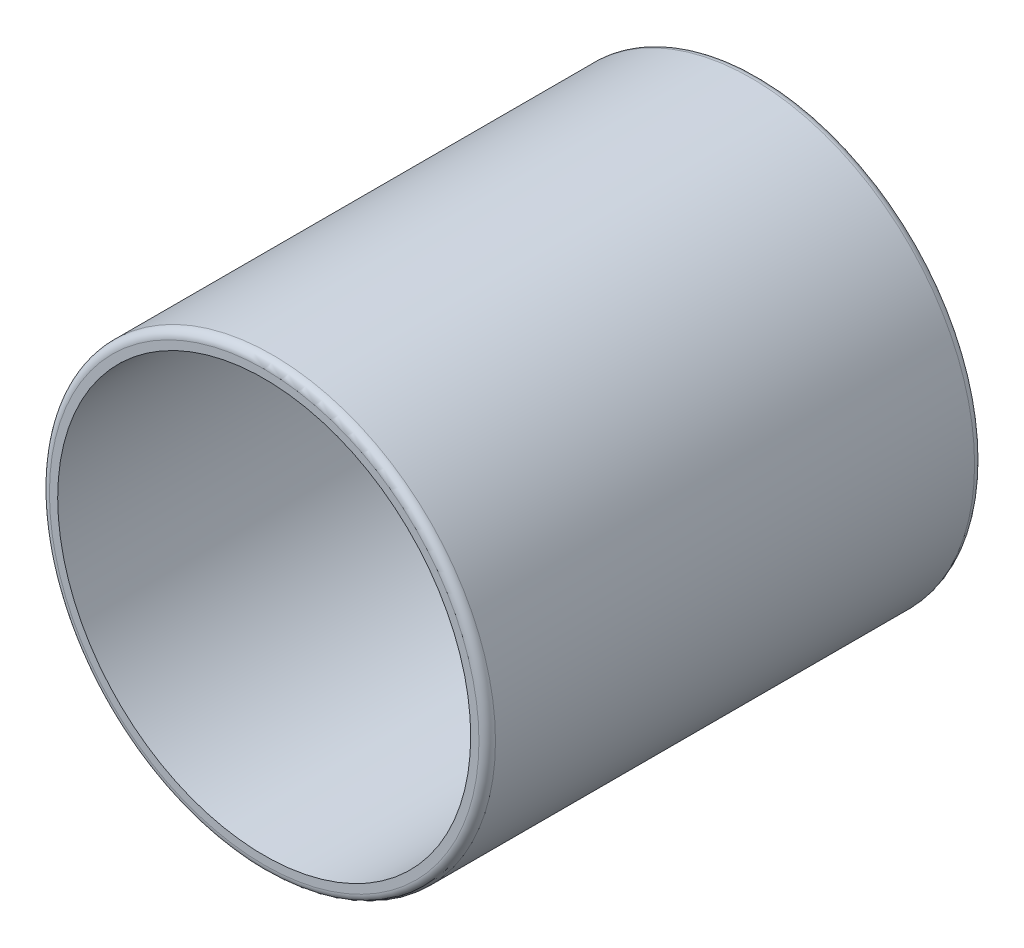
ISO-10303-21;
HEADER;
FILE_DESCRIPTION(('STEP AP214'),'2;1');
FILE_NAME('part.step','',(''),(''),'','','');
FILE_SCHEMA(('AUTOMOTIVE_DESIGN { 1 0 10303 214 1 1 1 1 }'));
ENDSEC;
DATA;
#1=APPLICATION_CONTEXT('core data for automotive mechanical design processes');
#2=APPLICATION_PROTOCOL_DEFINITION('international standard','automotive_design',2000,#1);
#3=PRODUCT_CONTEXT('',#1,'mechanical');
#4=PRODUCT('Part','Part','',(#3));
#5=PRODUCT_RELATED_PRODUCT_CATEGORY('part','',(#4));
#6=PRODUCT_DEFINITION_FORMATION('','',#4);
#7=PRODUCT_DEFINITION_CONTEXT('part definition',#1,'design');
#8=PRODUCT_DEFINITION('design','',#6,#7);
#9=PRODUCT_DEFINITION_SHAPE('','',#8);
#10=(LENGTH_UNIT() NAMED_UNIT(*) SI_UNIT(.MILLI.,.METRE.));
#11=(NAMED_UNIT(*) PLANE_ANGLE_UNIT() SI_UNIT($,.RADIAN.));
#12=(NAMED_UNIT(*) SI_UNIT($,.STERADIAN.) SOLID_ANGLE_UNIT());
#13=UNCERTAINTY_MEASURE_WITH_UNIT(LENGTH_MEASURE(1.E-05),#10,'distance_accuracy_value','');
#14=(GEOMETRIC_REPRESENTATION_CONTEXT(3) GLOBAL_UNCERTAINTY_ASSIGNED_CONTEXT((#13)) GLOBAL_UNIT_ASSIGNED_CONTEXT((#10,
#11,#12)) REPRESENTATION_CONTEXT('',''));
#15=CARTESIAN_POINT('',(0.,0.,0.));
#16=DIRECTION('',(0.,0.,1.));
#17=DIRECTION('',(1.,0.,0.));
#18=AXIS2_PLACEMENT_3D('',#15,#16,#17);
#19=CARTESIAN_POINT('',(0.,0.,600.));
#20=DIRECTION('',(0.,0.,1.));
#21=DIRECTION('',(1.,0.,0.));
#22=AXIS2_PLACEMENT_3D('',#19,#20,#21);
#23=PLANE('',#22);
#24=CARTESIAN_POINT('',(0.,0.,600.));
#25=DIRECTION('',(0.,0.,1.));
#26=DIRECTION('',(1.,0.,0.));
#27=AXIS2_PLACEMENT_3D('',#24,#25,#26);
#28=CIRCLE('',#27,260.);
#29=CARTESIAN_POINT('',(260.,0.,600.));
#30=VERTEX_POINT('',#29);
#31=EDGE_CURVE('E11',#30,#30,#28,.T.);
#32=ORIENTED_EDGE('',*,*,#31,.T.);
#33=EDGE_LOOP('',(#32));
#34=FACE_BOUND('',#33,.T.);
#35=CARTESIAN_POINT('',(0.,0.,600.));
#36=DIRECTION('',(0.,0.,1.));
#37=DIRECTION('',(1.,0.,0.));
#38=AXIS2_PLACEMENT_3D('',#35,#36,#37);
#39=CIRCLE('',#38,250.);
#40=CARTESIAN_POINT('',(250.,0.,600.));
#41=VERTEX_POINT('',#40);
#42=EDGE_CURVE('E60',#41,#41,#39,.T.);
#43=ORIENTED_EDGE('',*,*,#42,.F.);
#44=EDGE_LOOP('',(#43));
#45=FACE_BOUND('',#44,.T.);
#46=ADVANCED_FACE('F40',(#34,#45),#23,.T.);
#47=CARTESIAN_POINT('',(0.,0.,0.));
#48=DIRECTION('',(0.,0.,1.));
#49=DIRECTION('',(1.,0.,0.));
#50=AXIS2_PLACEMENT_3D('',#47,#48,#49);
#51=PLANE('',#50);
#52=CARTESIAN_POINT('',(0.,0.,0.));
#53=DIRECTION('',(0.,0.,1.));
#54=DIRECTION('',(1.,0.,0.));
#55=AXIS2_PLACEMENT_3D('',#52,#53,#54);
#56=CIRCLE('',#55,260.);
#57=CARTESIAN_POINT('',(260.,0.,0.));
#58=VERTEX_POINT('',#57);
#59=EDGE_CURVE('E47',#58,#58,#56,.F.);
#60=ORIENTED_EDGE('',*,*,#59,.T.);
#61=EDGE_LOOP('',(#60));
#62=FACE_BOUND('',#61,.T.);
#63=CARTESIAN_POINT('',(0.,0.,0.));
#64=DIRECTION('',(0.,0.,1.));
#65=DIRECTION('',(1.,0.,0.));
#66=AXIS2_PLACEMENT_3D('',#63,#64,#65);
#67=CIRCLE('',#66,250.);
#68=CARTESIAN_POINT('',(250.,0.,0.));
#69=VERTEX_POINT('',#68);
#70=EDGE_CURVE('E61',#69,#69,#67,.T.);
#71=ORIENTED_EDGE('',*,*,#70,.T.);
#72=EDGE_LOOP('',(#71));
#73=FACE_BOUND('',#72,.T.);
#74=ADVANCED_FACE('F71',(#62,#73),#51,.F.);
#75=CARTESIAN_POINT('',(0.,0.,600.));
#76=DIRECTION('',(0.,0.,-1.));
#77=DIRECTION('',(-1.,0.,0.));
#78=AXIS2_PLACEMENT_3D('',#75,#76,#77);
#79=CYLINDRICAL_SURFACE('',#78,270.);
#80=CARTESIAN_POINT('',(0.,0.,10.));
#81=DIRECTION('',(0.,0.,1.));
#82=DIRECTION('',(1.,0.,0.));
#83=AXIS2_PLACEMENT_3D('',#80,#81,#82);
#84=CIRCLE('',#83,270.);
#85=CARTESIAN_POINT('',(270.,0.,10.));
#86=VERTEX_POINT('',#85);
#87=EDGE_CURVE('E51',#86,#86,#84,.T.);
#88=ORIENTED_EDGE('',*,*,#87,.T.);
#89=EDGE_LOOP('',(#88));
#90=FACE_BOUND('',#89,.T.);
#91=CARTESIAN_POINT('',(0.,0.,590.));
#92=DIRECTION('',(0.,0.,1.));
#93=DIRECTION('',(1.,0.,0.));
#94=AXIS2_PLACEMENT_3D('',#91,#92,#93);
#95=CIRCLE('',#94,270.);
#96=CARTESIAN_POINT('',(270.,0.,590.));
#97=VERTEX_POINT('',#96);
#98=EDGE_CURVE('E55',#97,#97,#95,.F.);
#99=ORIENTED_EDGE('',*,*,#98,.T.);
#100=EDGE_LOOP('',(#99));
#101=FACE_BOUND('',#100,.T.);
#102=ADVANCED_FACE('F76',(#90,#101),#79,.T.);
#103=CARTESIAN_POINT('',(0.,0.,600.));
#104=DIRECTION('',(0.,0.,-1.));
#105=DIRECTION('',(-1.,0.,0.));
#106=AXIS2_PLACEMENT_3D('',#103,#104,#105);
#107=CYLINDRICAL_SURFACE('',#106,250.);
#108=ORIENTED_EDGE('',*,*,#42,.T.);
#109=EDGE_LOOP('',(#108));
#110=FACE_BOUND('',#109,.T.);
#111=ORIENTED_EDGE('',*,*,#70,.F.);
#112=EDGE_LOOP('',(#111));
#113=FACE_BOUND('',#112,.T.);
#114=ADVANCED_FACE('F67',(#110,#113),#107,.F.);
#115=CARTESIAN_POINT('',(0.,0.,10.));
#116=DIRECTION('',(0.,0.,1.));
#117=DIRECTION('',(1.,0.,0.));
#118=AXIS2_PLACEMENT_3D('',#115,#116,#117);
#119=TOROIDAL_SURFACE('',#118,260.,10.);
#120=ORIENTED_EDGE('',*,*,#59,.F.);
#121=EDGE_LOOP('',(#120));
#122=FACE_BOUND('',#121,.T.);
#123=ORIENTED_EDGE('',*,*,#87,.F.);
#124=EDGE_LOOP('',(#123));
#125=FACE_BOUND('',#124,.T.);
#126=ADVANCED_FACE('F82',(#122,#125),#119,.T.);
#127=CARTESIAN_POINT('',(0.,0.,590.));
#128=DIRECTION('',(0.,0.,1.));
#129=DIRECTION('',(1.,0.,0.));
#130=AXIS2_PLACEMENT_3D('',#127,#128,#129);
#131=TOROIDAL_SURFACE('',#130,260.,10.);
#132=ORIENTED_EDGE('',*,*,#98,.F.);
#133=EDGE_LOOP('',(#132));
#134=FACE_BOUND('',#133,.T.);
#135=ORIENTED_EDGE('',*,*,#31,.F.);
#136=EDGE_LOOP('',(#135));
#137=FACE_BOUND('',#136,.T.);
#138=ADVANCED_FACE('F42',(#134,#137),#131,.T.);
#139=CLOSED_SHELL('',(#46,#74,#102,#114,#126,#138));
#140=MANIFOLD_SOLID_BREP('B2',#139);
#141=ADVANCED_BREP_SHAPE_REPRESENTATION('',(#18,#140),#14);
#142=SHAPE_DEFINITION_REPRESENTATION(#9,#141);
ENDSEC;
END-ISO-10303-21;
